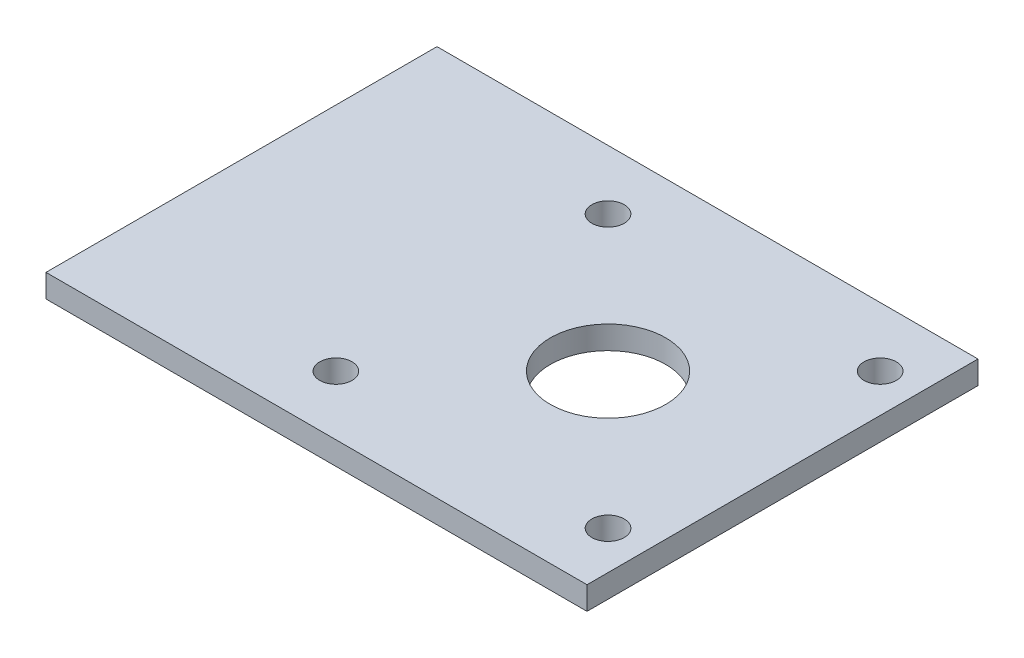
ISO-10303-21;
HEADER;
FILE_DESCRIPTION(('STEP AP214'),'2;1');
FILE_NAME('part.step','',(''),(''),'','','');
FILE_SCHEMA(('AUTOMOTIVE_DESIGN { 1 0 10303 214 1 1 1 1 }'));
ENDSEC;
DATA;
#1=APPLICATION_CONTEXT('core data for automotive mechanical design processes');
#2=APPLICATION_PROTOCOL_DEFINITION('international standard','automotive_design',2000,#1);
#3=PRODUCT_CONTEXT('',#1,'mechanical');
#4=PRODUCT('Part','Part','',(#3));
#5=PRODUCT_RELATED_PRODUCT_CATEGORY('part','',(#4));
#6=PRODUCT_DEFINITION_FORMATION('','',#4);
#7=PRODUCT_DEFINITION_CONTEXT('part definition',#1,'design');
#8=PRODUCT_DEFINITION('design','',#6,#7);
#9=PRODUCT_DEFINITION_SHAPE('','',#8);
#10=(LENGTH_UNIT() NAMED_UNIT(*) SI_UNIT(.MILLI.,.METRE.));
#11=(NAMED_UNIT(*) PLANE_ANGLE_UNIT() SI_UNIT($,.RADIAN.));
#12=(NAMED_UNIT(*) SI_UNIT($,.STERADIAN.) SOLID_ANGLE_UNIT());
#13=UNCERTAINTY_MEASURE_WITH_UNIT(LENGTH_MEASURE(1.E-05),#10,'distance_accuracy_value','');
#14=(GEOMETRIC_REPRESENTATION_CONTEXT(3) GLOBAL_UNCERTAINTY_ASSIGNED_CONTEXT((#13)) GLOBAL_UNIT_ASSIGNED_CONTEXT((#10,
#11,#12)) REPRESENTATION_CONTEXT('',''));
#15=CARTESIAN_POINT('',(0.,0.,0.));
#16=DIRECTION('',(0.,0.,1.));
#17=DIRECTION('',(1.,0.,0.));
#18=AXIS2_PLACEMENT_3D('',#15,#16,#17);
#19=CARTESIAN_POINT('',(0.,3.,0.));
#20=DIRECTION('',(0.,1.,0.));
#21=DIRECTION('',(0.,0.,1.));
#22=AXIS2_PLACEMENT_3D('',#19,#20,#21);
#23=PLANE('',#22);
#24=DIRECTION('',(0.,0.,1.));
#25=VECTOR('',#24,1.);
#26=CARTESIAN_POINT('',(22.669431350051,3.,0.));
#27=LINE('',#26,#25);
#28=CARTESIAN_POINT('',(22.669431350051,3.,-25.4));
#29=VERTEX_POINT('',#28);
#30=CARTESIAN_POINT('',(22.669431350051,3.,25.4));
#31=VERTEX_POINT('',#30);
#32=EDGE_CURVE('E61',#29,#31,#27,.T.);
#33=ORIENTED_EDGE('',*,*,#32,.F.);
#34=DIRECTION('',(-1.,0.,0.));
#35=VECTOR('',#34,1.);
#36=CARTESIAN_POINT('',(-47.625,3.,-25.4));
#37=LINE('',#36,#35);
#38=CARTESIAN_POINT('',(-47.625,3.,-25.4));
#39=VERTEX_POINT('',#38);
#40=EDGE_CURVE('E106',#29,#39,#37,.T.);
#41=ORIENTED_EDGE('',*,*,#40,.T.);
#42=DIRECTION('',(0.,0.,1.));
#43=VECTOR('',#42,1.);
#44=CARTESIAN_POINT('',(-47.625,3.,-25.4));
#45=LINE('',#44,#43);
#46=CARTESIAN_POINT('',(-47.625,3.,25.4));
#47=VERTEX_POINT('',#46);
#48=EDGE_CURVE('E70',#39,#47,#45,.T.);
#49=ORIENTED_EDGE('',*,*,#48,.T.);
#50=DIRECTION('',(1.,0.,0.));
#51=VECTOR('',#50,1.);
#52=CARTESIAN_POINT('',(-47.625,3.,25.4));
#53=LINE('',#52,#51);
#54=EDGE_CURVE('E98',#47,#31,#53,.T.);
#55=ORIENTED_EDGE('',*,*,#54,.T.);
#56=EDGE_LOOP('',(#33,#41,#49,#55));
#57=FACE_BOUND('',#56,.T.);
#58=CARTESIAN_POINT('',(0.,3.,0.));
#59=DIRECTION('',(0.,1.,0.));
#60=DIRECTION('',(0.,0.,1.));
#61=AXIS2_PLACEMENT_3D('',#58,#59,#60);
#62=CIRCLE('',#61,7.5);
#63=CARTESIAN_POINT('',(0.,3.,7.5));
#64=VERTEX_POINT('',#63);
#65=EDGE_CURVE('E149',#64,#64,#62,.T.);
#66=ORIENTED_EDGE('',*,*,#65,.F.);
#67=EDGE_LOOP('',(#66));
#68=FACE_BOUND('',#67,.T.);
#69=CARTESIAN_POINT('',(-17.68,3.,17.68));
#70=DIRECTION('',(0.,1.,0.));
#71=DIRECTION('',(0.,0.,1.));
#72=AXIS2_PLACEMENT_3D('',#69,#70,#71);
#73=CIRCLE('',#72,2.1);
#74=CARTESIAN_POINT('',(-17.68,3.,19.78));
#75=VERTEX_POINT('',#74);
#76=EDGE_CURVE('E113',#75,#75,#73,.F.);
#77=ORIENTED_EDGE('',*,*,#76,.T.);
#78=EDGE_LOOP('',(#77));
#79=FACE_BOUND('',#78,.T.);
#80=CARTESIAN_POINT('',(17.68,3.,17.68));
#81=DIRECTION('',(0.,1.,0.));
#82=DIRECTION('',(0.,0.,1.));
#83=AXIS2_PLACEMENT_3D('',#80,#81,#82);
#84=CIRCLE('',#83,2.1);
#85=CARTESIAN_POINT('',(17.68,3.,19.78));
#86=VERTEX_POINT('',#85);
#87=EDGE_CURVE('E129',#86,#86,#84,.F.);
#88=ORIENTED_EDGE('',*,*,#87,.T.);
#89=EDGE_LOOP('',(#88));
#90=FACE_BOUND('',#89,.T.);
#91=CARTESIAN_POINT('',(-17.68,3.,-17.68));
#92=DIRECTION('',(0.,1.,0.));
#93=DIRECTION('',(0.,0.,1.));
#94=AXIS2_PLACEMENT_3D('',#91,#92,#93);
#95=CIRCLE('',#94,2.1);
#96=CARTESIAN_POINT('',(-17.68,3.,-15.58));
#97=VERTEX_POINT('',#96);
#98=EDGE_CURVE('E125',#97,#97,#95,.T.);
#99=ORIENTED_EDGE('',*,*,#98,.F.);
#100=EDGE_LOOP('',(#99));
#101=FACE_BOUND('',#100,.T.);
#102=CARTESIAN_POINT('',(17.68,3.,-17.68));
#103=DIRECTION('',(0.,1.,0.));
#104=DIRECTION('',(0.,0.,1.));
#105=AXIS2_PLACEMENT_3D('',#102,#103,#104);
#106=CIRCLE('',#105,2.1);
#107=CARTESIAN_POINT('',(17.68,3.,-15.58));
#108=VERTEX_POINT('',#107);
#109=EDGE_CURVE('E121',#108,#108,#106,.T.);
#110=ORIENTED_EDGE('',*,*,#109,.F.);
#111=EDGE_LOOP('',(#110));
#112=FACE_BOUND('',#111,.T.);
#113=ADVANCED_FACE('F45',(#57,#68,#79,#90,#101,#112),#23,.T.);
#114=CARTESIAN_POINT('',(0.,0.,0.));
#115=DIRECTION('',(0.,1.,0.));
#116=DIRECTION('',(0.,0.,1.));
#117=AXIS2_PLACEMENT_3D('',#114,#115,#116);
#118=PLANE('',#117);
#119=CARTESIAN_POINT('',(0.,0.,0.));
#120=DIRECTION('',(0.,1.,0.));
#121=DIRECTION('',(0.,0.,1.));
#122=AXIS2_PLACEMENT_3D('',#119,#120,#121);
#123=CIRCLE('',#122,7.5);
#124=CARTESIAN_POINT('',(0.,0.,7.5));
#125=VERTEX_POINT('',#124);
#126=EDGE_CURVE('E153',#125,#125,#123,.T.);
#127=ORIENTED_EDGE('',*,*,#126,.T.);
#128=EDGE_LOOP('',(#127));
#129=FACE_BOUND('',#128,.T.);
#130=CARTESIAN_POINT('',(-17.68,0.,17.68));
#131=DIRECTION('',(0.,-1.,0.));
#132=DIRECTION('',(0.,0.,-1.));
#133=AXIS2_PLACEMENT_3D('',#130,#131,#132);
#134=CIRCLE('',#133,2.1);
#135=CARTESIAN_POINT('',(-17.68,0.,15.58));
#136=VERTEX_POINT('',#135);
#137=EDGE_CURVE('E137',#136,#136,#134,.T.);
#138=ORIENTED_EDGE('',*,*,#137,.F.);
#139=EDGE_LOOP('',(#138));
#140=FACE_BOUND('',#139,.T.);
#141=CARTESIAN_POINT('',(-17.68,0.,-17.68));
#142=DIRECTION('',(0.,1.,0.));
#143=DIRECTION('',(0.,0.,1.));
#144=AXIS2_PLACEMENT_3D('',#141,#142,#143);
#145=CIRCLE('',#144,2.1);
#146=CARTESIAN_POINT('',(-17.68,0.,-15.58));
#147=VERTEX_POINT('',#146);
#148=EDGE_CURVE('E142',#147,#147,#145,.T.);
#149=ORIENTED_EDGE('',*,*,#148,.T.);
#150=EDGE_LOOP('',(#149));
#151=FACE_BOUND('',#150,.T.);
#152=CARTESIAN_POINT('',(17.68,0.,17.68));
#153=DIRECTION('',(0.,-1.,0.));
#154=DIRECTION('',(0.,0.,-1.));
#155=AXIS2_PLACEMENT_3D('',#152,#153,#154);
#156=CIRCLE('',#155,2.1);
#157=CARTESIAN_POINT('',(17.68,0.,15.58));
#158=VERTEX_POINT('',#157);
#159=EDGE_CURVE('E133',#158,#158,#156,.T.);
#160=ORIENTED_EDGE('',*,*,#159,.F.);
#161=EDGE_LOOP('',(#160));
#162=FACE_BOUND('',#161,.T.);
#163=DIRECTION('',(-1.,0.,0.));
#164=VECTOR('',#163,1.);
#165=CARTESIAN_POINT('',(-47.625,0.,-25.4));
#166=LINE('',#165,#164);
#167=CARTESIAN_POINT('',(22.669431350051,0.,-25.4));
#168=VERTEX_POINT('',#167);
#169=CARTESIAN_POINT('',(-47.625,0.,-25.4));
#170=VERTEX_POINT('',#169);
#171=EDGE_CURVE('E92',#168,#170,#166,.T.);
#172=ORIENTED_EDGE('',*,*,#171,.F.);
#173=DIRECTION('',(0.,0.,1.));
#174=VECTOR('',#173,1.);
#175=CARTESIAN_POINT('',(22.669431350051,0.,-25.4));
#176=LINE('',#175,#174);
#177=CARTESIAN_POINT('',(22.669431350051,0.,25.4));
#178=VERTEX_POINT('',#177);
#179=EDGE_CURVE('E104',#168,#178,#176,.T.);
#180=ORIENTED_EDGE('',*,*,#179,.T.);
#181=DIRECTION('',(1.,0.,0.));
#182=VECTOR('',#181,1.);
#183=CARTESIAN_POINT('',(-47.625,0.,25.4));
#184=LINE('',#183,#182);
#185=CARTESIAN_POINT('',(-47.625,0.,25.4));
#186=VERTEX_POINT('',#185);
#187=EDGE_CURVE('E91',#186,#178,#184,.T.);
#188=ORIENTED_EDGE('',*,*,#187,.F.);
#189=DIRECTION('',(0.,0.,1.));
#190=VECTOR('',#189,1.);
#191=CARTESIAN_POINT('',(-47.625,0.,-25.4));
#192=LINE('',#191,#190);
#193=EDGE_CURVE('E82',#170,#186,#192,.T.);
#194=ORIENTED_EDGE('',*,*,#193,.F.);
#195=EDGE_LOOP('',(#172,#180,#188,#194));
#196=FACE_BOUND('',#195,.T.);
#197=CARTESIAN_POINT('',(17.68,0.,-17.68));
#198=DIRECTION('',(0.,1.,0.));
#199=DIRECTION('',(0.,0.,1.));
#200=AXIS2_PLACEMENT_3D('',#197,#198,#199);
#201=CIRCLE('',#200,2.1);
#202=CARTESIAN_POINT('',(17.68,0.,-15.58));
#203=VERTEX_POINT('',#202);
#204=EDGE_CURVE('E138',#203,#203,#201,.T.);
#205=ORIENTED_EDGE('',*,*,#204,.T.);
#206=EDGE_LOOP('',(#205));
#207=FACE_BOUND('',#206,.T.);
#208=ADVANCED_FACE('F101',(#129,#140,#151,#162,#196,#207),#118,.F.);
#209=CARTESIAN_POINT('',(-47.625,3.,-25.4));
#210=DIRECTION('',(0.,0.,1.));
#211=DIRECTION('',(1.,0.,0.));
#212=AXIS2_PLACEMENT_3D('',#209,#210,#211);
#213=PLANE('',#212);
#214=ORIENTED_EDGE('',*,*,#40,.F.);
#215=DIRECTION('',(0.,1.,0.));
#216=VECTOR('',#215,1.);
#217=CARTESIAN_POINT('',(22.669431350051,0.,-25.4));
#218=LINE('',#217,#216);
#219=EDGE_CURVE('E160',#168,#29,#218,.T.);
#220=ORIENTED_EDGE('',*,*,#219,.F.);
#221=ORIENTED_EDGE('',*,*,#171,.T.);
#222=DIRECTION('',(0.,-1.,0.));
#223=VECTOR('',#222,1.);
#224=CARTESIAN_POINT('',(-47.625,3.,-25.4));
#225=LINE('',#224,#223);
#226=EDGE_CURVE('E11',#39,#170,#225,.T.);
#227=ORIENTED_EDGE('',*,*,#226,.F.);
#228=EDGE_LOOP('',(#214,#220,#221,#227));
#229=FACE_BOUND('',#228,.T.);
#230=ADVANCED_FACE('F47',(#229),#213,.F.);
#231=CARTESIAN_POINT('',(-47.625,3.,-25.4));
#232=DIRECTION('',(1.,0.,0.));
#233=DIRECTION('',(0.,0.,-1.));
#234=AXIS2_PLACEMENT_3D('',#231,#232,#233);
#235=PLANE('',#234);
#236=ORIENTED_EDGE('',*,*,#193,.T.);
#237=DIRECTION('',(0.,-1.,0.));
#238=VECTOR('',#237,1.);
#239=CARTESIAN_POINT('',(-47.625,3.,25.4));
#240=LINE('',#239,#238);
#241=EDGE_CURVE('E54',#47,#186,#240,.T.);
#242=ORIENTED_EDGE('',*,*,#241,.F.);
#243=ORIENTED_EDGE('',*,*,#48,.F.);
#244=ORIENTED_EDGE('',*,*,#226,.T.);
#245=EDGE_LOOP('',(#236,#242,#243,#244));
#246=FACE_BOUND('',#245,.T.);
#247=ADVANCED_FACE('F84',(#246),#235,.F.);
#248=CARTESIAN_POINT('',(-47.625,3.,25.4));
#249=DIRECTION('',(0.,0.,-1.));
#250=DIRECTION('',(-1.,0.,0.));
#251=AXIS2_PLACEMENT_3D('',#248,#249,#250);
#252=PLANE('',#251);
#253=ORIENTED_EDGE('',*,*,#187,.T.);
#254=DIRECTION('',(0.,1.,0.));
#255=VECTOR('',#254,1.);
#256=CARTESIAN_POINT('',(22.669431350051,0.,25.4));
#257=LINE('',#256,#255);
#258=EDGE_CURVE('E159',#178,#31,#257,.T.);
#259=ORIENTED_EDGE('',*,*,#258,.T.);
#260=ORIENTED_EDGE('',*,*,#54,.F.);
#261=ORIENTED_EDGE('',*,*,#241,.T.);
#262=EDGE_LOOP('',(#253,#259,#260,#261));
#263=FACE_BOUND('',#262,.T.);
#264=ADVANCED_FACE('F96',(#263),#252,.F.);
#265=CARTESIAN_POINT('',(17.68,0.,17.68));
#266=DIRECTION('',(0.,1.,0.));
#267=DIRECTION('',(0.,0.,1.));
#268=AXIS2_PLACEMENT_3D('',#265,#266,#267);
#269=CYLINDRICAL_SURFACE('',#268,2.1);
#270=ORIENTED_EDGE('',*,*,#87,.F.);
#271=EDGE_LOOP('',(#270));
#272=FACE_BOUND('',#271,.T.);
#273=ORIENTED_EDGE('',*,*,#159,.T.);
#274=EDGE_LOOP('',(#273));
#275=FACE_BOUND('',#274,.T.);
#276=ADVANCED_FACE('F192',(#272,#275),#269,.F.);
#277=CARTESIAN_POINT('',(-17.68,0.,-17.68));
#278=DIRECTION('',(0.,1.,0.));
#279=DIRECTION('',(0.,0.,1.));
#280=AXIS2_PLACEMENT_3D('',#277,#278,#279);
#281=CYLINDRICAL_SURFACE('',#280,2.1);
#282=ORIENTED_EDGE('',*,*,#98,.T.);
#283=EDGE_LOOP('',(#282));
#284=FACE_BOUND('',#283,.T.);
#285=ORIENTED_EDGE('',*,*,#148,.F.);
#286=EDGE_LOOP('',(#285));
#287=FACE_BOUND('',#286,.T.);
#288=ADVANCED_FACE('F229',(#284,#287),#281,.F.);
#289=CARTESIAN_POINT('',(17.68,0.,-17.68));
#290=DIRECTION('',(0.,1.,0.));
#291=DIRECTION('',(0.,0.,1.));
#292=AXIS2_PLACEMENT_3D('',#289,#290,#291);
#293=CYLINDRICAL_SURFACE('',#292,2.1);
#294=ORIENTED_EDGE('',*,*,#109,.T.);
#295=EDGE_LOOP('',(#294));
#296=FACE_BOUND('',#295,.T.);
#297=ORIENTED_EDGE('',*,*,#204,.F.);
#298=EDGE_LOOP('',(#297));
#299=FACE_BOUND('',#298,.T.);
#300=ADVANCED_FACE('F238',(#296,#299),#293,.F.);
#301=CARTESIAN_POINT('',(-17.68,0.,17.68));
#302=DIRECTION('',(0.,1.,0.));
#303=DIRECTION('',(0.,0.,1.));
#304=AXIS2_PLACEMENT_3D('',#301,#302,#303);
#305=CYLINDRICAL_SURFACE('',#304,2.1);
#306=ORIENTED_EDGE('',*,*,#76,.F.);
#307=EDGE_LOOP('',(#306));
#308=FACE_BOUND('',#307,.T.);
#309=ORIENTED_EDGE('',*,*,#137,.T.);
#310=EDGE_LOOP('',(#309));
#311=FACE_BOUND('',#310,.T.);
#312=ADVANCED_FACE('F181',(#308,#311),#305,.F.);
#313=CARTESIAN_POINT('',(0.,0.,0.));
#314=DIRECTION('',(0.,1.,0.));
#315=DIRECTION('',(0.,0.,1.));
#316=AXIS2_PLACEMENT_3D('',#313,#314,#315);
#317=CYLINDRICAL_SURFACE('',#316,7.5);
#318=ORIENTED_EDGE('',*,*,#65,.T.);
#319=EDGE_LOOP('',(#318));
#320=FACE_BOUND('',#319,.T.);
#321=ORIENTED_EDGE('',*,*,#126,.F.);
#322=EDGE_LOOP('',(#321));
#323=FACE_BOUND('',#322,.T.);
#324=ADVANCED_FACE('F175',(#320,#323),#317,.F.);
#325=CARTESIAN_POINT('',(22.669431350051,0.,-25.4));
#326=DIRECTION('',(-1.,0.,0.));
#327=DIRECTION('',(0.,0.,1.));
#328=AXIS2_PLACEMENT_3D('',#325,#326,#327);
#329=PLANE('',#328);
#330=ORIENTED_EDGE('',*,*,#32,.T.);
#331=ORIENTED_EDGE('',*,*,#258,.F.);
#332=ORIENTED_EDGE('',*,*,#179,.F.);
#333=ORIENTED_EDGE('',*,*,#219,.T.);
#334=EDGE_LOOP('',(#330,#331,#332,#333));
#335=FACE_BOUND('',#334,.T.);
#336=ADVANCED_FACE('F173',(#335),#329,.F.);
#337=CLOSED_SHELL('',(#113,#208,#230,#247,#264,#276,#288,#300,#312,#324,#336));
#338=MANIFOLD_SOLID_BREP('B2',#337);
#339=ADVANCED_BREP_SHAPE_REPRESENTATION('',(#18,#338),#14);
#340=SHAPE_DEFINITION_REPRESENTATION(#9,#339);
ENDSEC;
END-ISO-10303-21;
